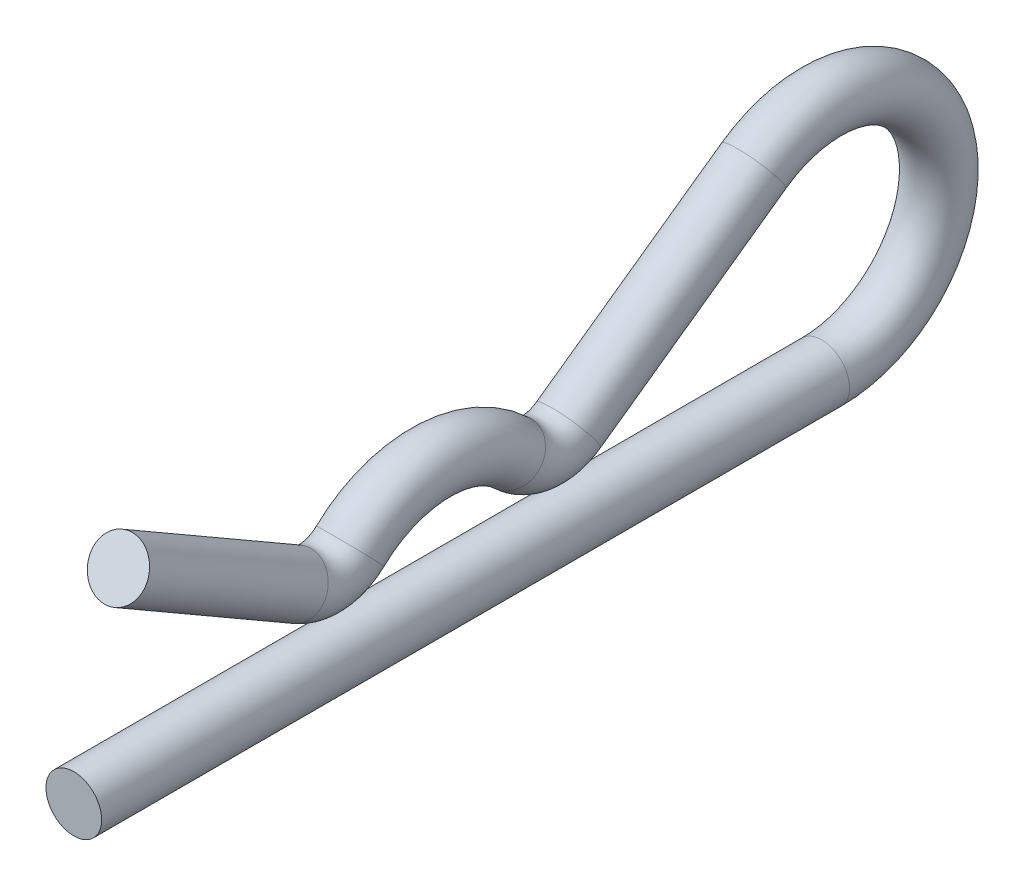
ISO-10303-21;
HEADER;
FILE_DESCRIPTION(('STEP AP214'),'2;1');
FILE_NAME('part.step','',(''),(''),'','','');
FILE_SCHEMA(('AUTOMOTIVE_DESIGN { 1 0 10303 214 1 1 1 1 }'));
ENDSEC;
DATA;
#1=APPLICATION_CONTEXT('core data for automotive mechanical design processes');
#2=APPLICATION_PROTOCOL_DEFINITION('international standard','automotive_design',2000,#1);
#3=PRODUCT_CONTEXT('',#1,'mechanical');
#4=PRODUCT('Part','Part','',(#3));
#5=PRODUCT_RELATED_PRODUCT_CATEGORY('part','',(#4));
#6=PRODUCT_DEFINITION_FORMATION('','',#4);
#7=PRODUCT_DEFINITION_CONTEXT('part definition',#1,'design');
#8=PRODUCT_DEFINITION('design','',#6,#7);
#9=PRODUCT_DEFINITION_SHAPE('','',#8);
#10=(LENGTH_UNIT() NAMED_UNIT(*) SI_UNIT(.MILLI.,.METRE.));
#11=(NAMED_UNIT(*) PLANE_ANGLE_UNIT() SI_UNIT($,.RADIAN.));
#12=(NAMED_UNIT(*) SI_UNIT($,.STERADIAN.) SOLID_ANGLE_UNIT());
#13=UNCERTAINTY_MEASURE_WITH_UNIT(LENGTH_MEASURE(1.E-05),#10,'distance_accuracy_value','');
#14=(GEOMETRIC_REPRESENTATION_CONTEXT(3) GLOBAL_UNCERTAINTY_ASSIGNED_CONTEXT((#13)) GLOBAL_UNIT_ASSIGNED_CONTEXT((#10,
#11,#12)) REPRESENTATION_CONTEXT('',''));
#15=CARTESIAN_POINT('',(0.,0.,0.));
#16=DIRECTION('',(0.,0.,1.));
#17=DIRECTION('',(1.,0.,0.));
#18=AXIS2_PLACEMENT_3D('',#15,#16,#17);
#19=CARTESIAN_POINT('',(0.,-4.1656,15.875));
#20=DIRECTION('',(0.,0.,1.));
#21=DIRECTION('',(1.,0.,0.));
#22=AXIS2_PLACEMENT_3D('',#19,#20,#21);
#23=PLANE('',#22);
#24=CARTESIAN_POINT('',(0.,-4.1656,15.875));
#25=DIRECTION('',(0.,0.,1.));
#26=DIRECTION('',(1.,0.,0.));
#27=AXIS2_PLACEMENT_3D('',#24,#25,#26);
#28=CIRCLE('',#27,0.990599999999999);
#29=CARTESIAN_POINT('',(0.990599999999999,-4.1656,15.875));
#30=VERTEX_POINT('',#29);
#31=EDGE_CURVE('E47',#30,#30,#28,.T.);
#32=ORIENTED_EDGE('',*,*,#31,.T.);
#33=EDGE_LOOP('',(#32));
#34=FACE_BOUND('',#33,.T.);
#35=ADVANCED_FACE('F35',(#34),#23,.T.);
#36=CARTESIAN_POINT('',(0.,2.29172552760126,14.2875));
#37=DIRECTION('',(0.,-0.499999999999991,-0.866025403784444));
#38=DIRECTION('',(1.,0.,0.));
#39=AXIS2_PLACEMENT_3D('',#36,#37,#38);
#40=PLANE('',#39);
#41=CARTESIAN_POINT('',(0.,2.29172552760126,14.2875));
#42=DIRECTION('',(0.,-0.499999999999991,-0.866025403784444));
#43=DIRECTION('',(1.,0.,0.));
#44=AXIS2_PLACEMENT_3D('',#41,#42,#43);
#45=CIRCLE('',#44,0.990599999999999);
#46=CARTESIAN_POINT('',(0.990599999999999,2.29172552760126,14.2875));
#47=VERTEX_POINT('',#46);
#48=EDGE_CURVE('E11',#47,#47,#45,.T.);
#49=ORIENTED_EDGE('',*,*,#48,.F.);
#50=EDGE_LOOP('',(#49));
#51=FACE_BOUND('',#50,.T.);
#52=ADVANCED_FACE('F53',(#51),#40,.F.);
#53=CARTESIAN_POINT('',(0.,-4.1656,15.875));
#54=DIRECTION('',(0.,0.,-1.));
#55=DIRECTION('',(0.,1.,0.));
#56=AXIS2_PLACEMENT_3D('',#53,#54,#55);
#57=CYLINDRICAL_SURFACE('',#56,0.990599999999999);
#58=CARTESIAN_POINT('',(0.,-4.1656,-10.7188));
#59=DIRECTION('',(0.,0.,1.));
#60=DIRECTION('',(1.,0.,0.));
#61=AXIS2_PLACEMENT_3D('',#58,#59,#60);
#62=CIRCLE('',#61,0.990599999999999);
#63=CARTESIAN_POINT('',(0.,-5.1562,-10.7188));
#64=VERTEX_POINT('',#63);
#65=EDGE_CURVE('E95',#64,#64,#62,.T.);
#66=ORIENTED_EDGE('',*,*,#65,.T.);
#67=EDGE_LOOP('',(#66));
#68=FACE_BOUND('',#67,.T.);
#69=ORIENTED_EDGE('',*,*,#31,.F.);
#70=EDGE_LOOP('',(#69));
#71=FACE_BOUND('',#70,.T.);
#72=ADVANCED_FACE('F55',(#68,#71),#57,.T.);
#73=CARTESIAN_POINT('',(0.,0.,-10.7188));
#74=DIRECTION('',(1.,0.,0.));
#75=DIRECTION('',(0.,0.,-1.));
#76=AXIS2_PLACEMENT_3D('',#73,#74,#75);
#77=TOROIDAL_SURFACE('',#76,4.1656,0.990599999999999);
#78=CARTESIAN_POINT('',(0.,3.39450049262187,-8.30434565883099));
#79=DIRECTION('',(0.,0.579617423941091,-0.814888729744063));
#80=DIRECTION('',(1.,0.,0.));
#81=AXIS2_PLACEMENT_3D('',#78,#79,#80);
#82=CIRCLE('',#81,0.990599999999999);
#83=CARTESIAN_POINT('',(0.,4.20172926830634,-7.73017663867494));
#84=VERTEX_POINT('',#83);
#85=EDGE_CURVE('E92',#84,#84,#82,.T.);
#86=CARTESIAN_POINT('',(0.,0.,-10.7188));
#87=DIRECTION('',(1.,0.,0.));
#88=DIRECTION('',(0.,0.,-1.));
#89=AXIS2_PLACEMENT_3D('',#86,#87,#88);
#90=CIRCLE('',#89,5.1562);
#91=EDGE_CURVE('',#64,#84,#90,.T.);
#92=ORIENTED_EDGE('',*,*,#65,.F.);
#93=ORIENTED_EDGE('',*,*,#85,.T.);
#94=ORIENTED_EDGE('',*,*,#91,.T.);
#95=ORIENTED_EDGE('',*,*,#91,.F.);
#96=EDGE_LOOP('',(#92,#94,#93,#95));
#97=FACE_BOUND('',#96,.T.);
#98=ADVANCED_FACE('F60',(#97),#77,.T.);
#99=CARTESIAN_POINT('',(0.,3.39450049262187,-8.30434565883099));
#100=DIRECTION('',(0.,-0.579617423941091,0.814888729744064));
#101=DIRECTION('',(0.,-0.814888729744064,-0.579617423941091));
#102=AXIS2_PLACEMENT_3D('',#99,#100,#101);
#103=CYLINDRICAL_SURFACE('',#102,0.990599999999999);
#104=CARTESIAN_POINT('',(0.,-1.2936358584687,-1.71325760969836));
#105=DIRECTION('',(0.,0.579617423941091,-0.814888729744064));
#106=DIRECTION('',(1.,0.,0.));
#107=AXIS2_PLACEMENT_3D('',#104,#105,#106);
#108=CIRCLE('',#107,0.990599999999999);
#109=CARTESIAN_POINT('',(0.,-2.10086463415316,-2.2874266298544));
#110=VERTEX_POINT('',#109);
#111=EDGE_CURVE('E97',#110,#110,#108,.T.);
#112=ORIENTED_EDGE('',*,*,#111,.T.);
#113=EDGE_LOOP('',(#112));
#114=FACE_BOUND('',#113,.T.);
#115=ORIENTED_EDGE('',*,*,#85,.F.);
#116=EDGE_LOOP('',(#115));
#117=FACE_BOUND('',#116,.T.);
#118=ADVANCED_FACE('F80',(#114,#117),#103,.T.);
#119=CARTESIAN_POINT('',(0.,0.,-0.793114949191872));
#120=DIRECTION('',(-1.,0.,0.));
#121=DIRECTION('',(0.,0.,1.));
#122=AXIS2_PLACEMENT_3D('',#119,#120,#121);
#123=TOROIDAL_SURFACE('',#122,1.5875,0.990599999999999);
#124=CARTESIAN_POINT('',(0.,-1.14944812362031,0.301839506986902));
#125=DIRECTION('',(0.,-0.689735090506314,-0.724061810154525));
#126=DIRECTION('',(1.,0.,0.));
#127=AXIS2_PLACEMENT_3D('',#124,#125,#126);
#128=CIRCLE('',#127,0.990599999999999);
#129=CARTESIAN_POINT('',(0.,-1.86670375275938,0.985091087642455));
#130=VERTEX_POINT('',#129);
#131=EDGE_CURVE('E103',#130,#130,#128,.T.);
#132=CARTESIAN_POINT('',(0.,0.,-0.793114949191872));
#133=DIRECTION('',(-1.,0.,0.));
#134=DIRECTION('',(0.,0.,1.));
#135=AXIS2_PLACEMENT_3D('',#132,#133,#134);
#136=CIRCLE('',#135,2.5781);
#137=EDGE_CURVE('',#110,#130,#136,.T.);
#138=ORIENTED_EDGE('',*,*,#111,.F.);
#139=ORIENTED_EDGE('',*,*,#131,.T.);
#140=ORIENTED_EDGE('',*,*,#137,.T.);
#141=ORIENTED_EDGE('',*,*,#137,.F.);
#142=EDGE_LOOP('',(#138,#140,#139,#141));
#143=FACE_BOUND('',#142,.T.);
#144=ADVANCED_FACE('F76',(#143),#123,.T.);
#145=CARTESIAN_POINT('',(0.,-4.1656,3.175));
#146=DIRECTION('',(1.,0.,0.));
#147=DIRECTION('',(0.,0.,-1.));
#148=AXIS2_PLACEMENT_3D('',#145,#146,#147);
#149=TOROIDAL_SURFACE('',#148,4.1656,0.990599999999999);
#150=CARTESIAN_POINT('',(0.,-1.14944812362031,6.0481604930131));
#151=DIRECTION('',(0.,0.689735090506313,-0.724061810154526));
#152=DIRECTION('',(1.,0.,0.));
#153=AXIS2_PLACEMENT_3D('',#150,#151,#152);
#154=CIRCLE('',#153,0.990599999999999);
#155=CARTESIAN_POINT('',(0.,-1.86670375275938,5.36490891235754));
#156=VERTEX_POINT('',#155);
#157=EDGE_CURVE('E106',#156,#156,#154,.T.);
#158=ORIENTED_EDGE('',*,*,#157,.T.);
#159=EDGE_LOOP('',(#158));
#160=FACE_BOUND('',#159,.T.);
#161=ORIENTED_EDGE('',*,*,#131,.F.);
#162=EDGE_LOOP('',(#161));
#163=FACE_BOUND('',#162,.T.);
#164=ADVANCED_FACE('F70',(#160,#163),#149,.T.);
#165=CARTESIAN_POINT('',(0.,0.,7.14311494919187));
#166=DIRECTION('',(-1.,0.,0.));
#167=DIRECTION('',(0.,0.,1.));
#168=AXIS2_PLACEMENT_3D('',#165,#166,#167);
#169=TOROIDAL_SURFACE('',#168,1.5875,0.990599999999999);
#170=CARTESIAN_POINT('',(0.,-1.3748153285078,7.93686494919185));
#171=DIRECTION('',(0.,-0.49999999999999,-0.866025403784444));
#172=DIRECTION('',(1.,0.,0.));
#173=AXIS2_PLACEMENT_3D('',#170,#171,#172);
#174=CIRCLE('',#173,0.990599999999999);
#175=CARTESIAN_POINT('',(0.,-2.23270009349667,8.43216494919184));
#176=VERTEX_POINT('',#175);
#177=EDGE_CURVE('E42',#176,#176,#174,.T.);
#178=CARTESIAN_POINT('',(0.,0.,7.14311494919187));
#179=DIRECTION('',(-1.,0.,0.));
#180=DIRECTION('',(0.,0.,1.));
#181=AXIS2_PLACEMENT_3D('',#178,#179,#180);
#182=CIRCLE('',#181,2.5781);
#183=EDGE_CURVE('',#156,#176,#182,.T.);
#184=ORIENTED_EDGE('',*,*,#157,.F.);
#185=ORIENTED_EDGE('',*,*,#177,.T.);
#186=ORIENTED_EDGE('',*,*,#183,.T.);
#187=ORIENTED_EDGE('',*,*,#183,.F.);
#188=EDGE_LOOP('',(#184,#186,#185,#187));
#189=FACE_BOUND('',#188,.T.);
#190=ADVANCED_FACE('F66',(#189),#169,.T.);
#191=CARTESIAN_POINT('',(0.,-1.3748153285078,7.93686494919185));
#192=DIRECTION('',(0.,0.49999999999999,0.866025403784444));
#193=DIRECTION('',(0.,-0.866025403784444,0.49999999999999));
#194=AXIS2_PLACEMENT_3D('',#191,#192,#193);
#195=CYLINDRICAL_SURFACE('',#194,0.990599999999999);
#196=ORIENTED_EDGE('',*,*,#48,.T.);
#197=EDGE_LOOP('',(#196));
#198=FACE_BOUND('',#197,.T.);
#199=ORIENTED_EDGE('',*,*,#177,.F.);
#200=EDGE_LOOP('',(#199));
#201=FACE_BOUND('',#200,.T.);
#202=ADVANCED_FACE('F50',(#198,#201),#195,.T.);
#203=CLOSED_SHELL('',(#35,#52,#72,#98,#118,#144,#164,#190,#202));
#204=MANIFOLD_SOLID_BREP('B2',#203);
#205=ADVANCED_BREP_SHAPE_REPRESENTATION('',(#18,#204),#14);
#206=SHAPE_DEFINITION_REPRESENTATION(#9,#205);
ENDSEC;
END-ISO-10303-21;
